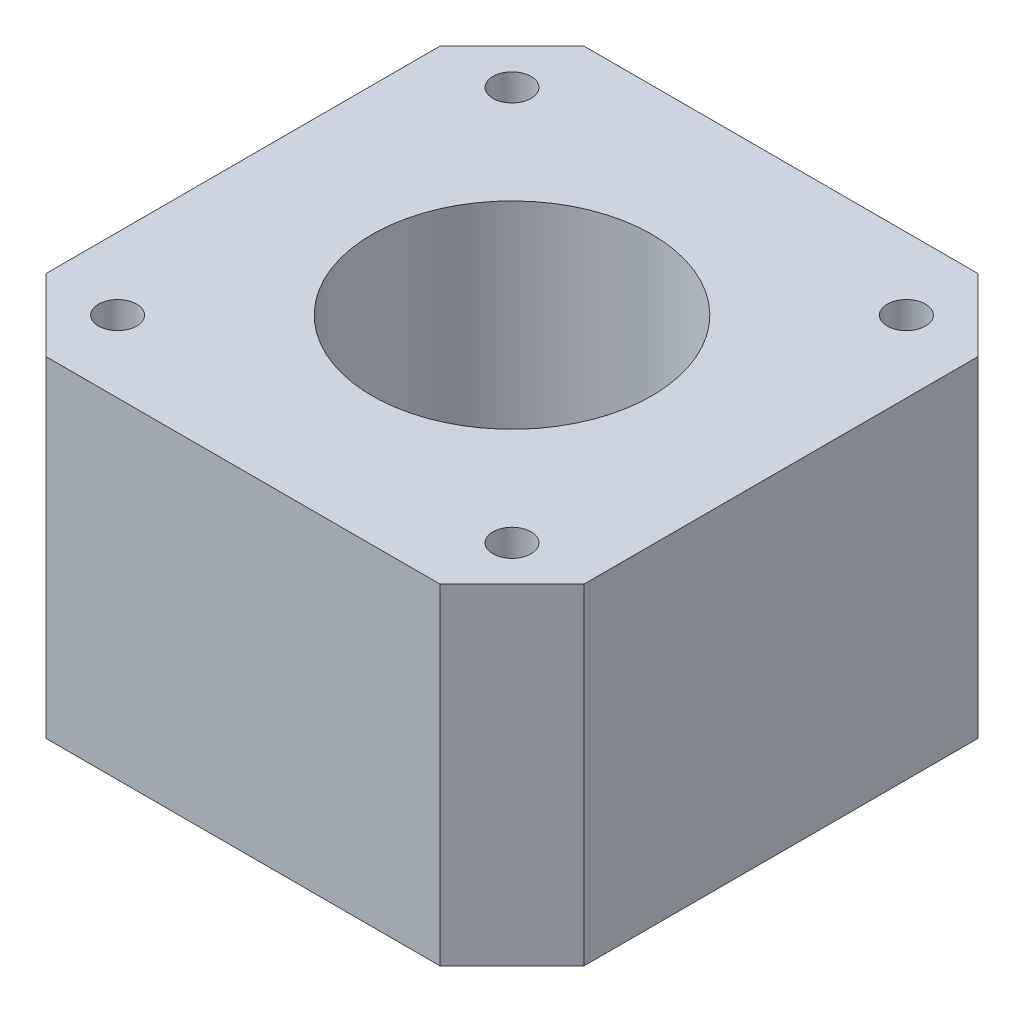
ISO-10303-21;
HEADER;
FILE_DESCRIPTION(('STEP AP214'),'2;1');
FILE_NAME('part.step','',(''),(''),'','','');
FILE_SCHEMA(('AUTOMOTIVE_DESIGN { 1 0 10303 214 1 1 1 1 }'));
ENDSEC;
DATA;
#1=APPLICATION_CONTEXT('core data for automotive mechanical design processes');
#2=APPLICATION_PROTOCOL_DEFINITION('international standard','automotive_design',2000,#1);
#3=PRODUCT_CONTEXT('',#1,'mechanical');
#4=PRODUCT('Part','Part','',(#3));
#5=PRODUCT_RELATED_PRODUCT_CATEGORY('part','',(#4));
#6=PRODUCT_DEFINITION_FORMATION('','',#4);
#7=PRODUCT_DEFINITION_CONTEXT('part definition',#1,'design');
#8=PRODUCT_DEFINITION('design','',#6,#7);
#9=PRODUCT_DEFINITION_SHAPE('','',#8);
#10=(LENGTH_UNIT() NAMED_UNIT(*) SI_UNIT(.MILLI.,.METRE.));
#11=(NAMED_UNIT(*) PLANE_ANGLE_UNIT() SI_UNIT($,.RADIAN.));
#12=(NAMED_UNIT(*) SI_UNIT($,.STERADIAN.) SOLID_ANGLE_UNIT());
#13=UNCERTAINTY_MEASURE_WITH_UNIT(LENGTH_MEASURE(1.E-05),#10,'distance_accuracy_value','');
#14=(GEOMETRIC_REPRESENTATION_CONTEXT(3) GLOBAL_UNCERTAINTY_ASSIGNED_CONTEXT((#13)) GLOBAL_UNIT_ASSIGNED_CONTEXT((#10,
#11,#12)) REPRESENTATION_CONTEXT('',''));
#15=CARTESIAN_POINT('',(0.,0.,0.));
#16=DIRECTION('',(0.,0.,1.));
#17=DIRECTION('',(1.,0.,0.));
#18=AXIS2_PLACEMENT_3D('',#15,#16,#17);
#19=CARTESIAN_POINT('',(0.,26.,21.15));
#20=DIRECTION('',(0.,0.,-1.));
#21=DIRECTION('',(-1.,0.,0.));
#22=AXIS2_PLACEMENT_3D('',#19,#20,#21);
#23=PLANE('',#22);
#24=DIRECTION('',(1.,0.,0.));
#25=VECTOR('',#24,1.);
#26=CARTESIAN_POINT('',(0.,0.,21.15));
#27=LINE('',#26,#25);
#28=CARTESIAN_POINT('',(-15.4931457505076,0.,21.15));
#29=VERTEX_POINT('',#28);
#30=CARTESIAN_POINT('',(15.4931457505076,0.,21.15));
#31=VERTEX_POINT('',#30);
#32=EDGE_CURVE('E159',#29,#31,#27,.T.);
#33=ORIENTED_EDGE('',*,*,#32,.T.);
#34=DIRECTION('',(0.,-1.,0.));
#35=VECTOR('',#34,1.);
#36=CARTESIAN_POINT('',(15.4931457505076,26.,21.15));
#37=LINE('',#36,#35);
#38=CARTESIAN_POINT('',(15.4931457505076,26.,21.15));
#39=VERTEX_POINT('',#38);
#40=EDGE_CURVE('E201',#39,#31,#37,.T.);
#41=ORIENTED_EDGE('',*,*,#40,.F.);
#42=DIRECTION('',(1.,0.,0.));
#43=VECTOR('',#42,1.);
#44=CARTESIAN_POINT('',(0.,26.,21.15));
#45=LINE('',#44,#43);
#46=CARTESIAN_POINT('',(-15.4931457505076,26.,21.15));
#47=VERTEX_POINT('',#46);
#48=EDGE_CURVE('E234',#47,#39,#45,.T.);
#49=ORIENTED_EDGE('',*,*,#48,.F.);
#50=DIRECTION('',(0.,-1.,0.));
#51=VECTOR('',#50,1.);
#52=CARTESIAN_POINT('',(-15.4931457505076,26.,21.15));
#53=LINE('',#52,#51);
#54=EDGE_CURVE('E154',#47,#29,#53,.T.);
#55=ORIENTED_EDGE('',*,*,#54,.T.);
#56=EDGE_LOOP('',(#33,#41,#49,#55));
#57=FACE_BOUND('',#56,.T.);
#58=ADVANCED_FACE('F49',(#57),#23,.F.);
#59=CARTESIAN_POINT('',(18.3215728752538,26.,18.3215728752538));
#60=DIRECTION('',(-0.707106781186548,0.,-0.707106781186547));
#61=DIRECTION('',(-0.707106781186547,0.,0.707106781186548));
#62=AXIS2_PLACEMENT_3D('',#59,#60,#61);
#63=PLANE('',#62);
#64=DIRECTION('',(0.707106781186547,0.,-0.707106781186548));
#65=VECTOR('',#64,1.);
#66=CARTESIAN_POINT('',(18.3215728752538,0.,18.3215728752538));
#67=LINE('',#66,#65);
#68=CARTESIAN_POINT('',(21.15,0.,15.4931457505076));
#69=VERTEX_POINT('',#68);
#70=EDGE_CURVE('E163',#31,#69,#67,.T.);
#71=ORIENTED_EDGE('',*,*,#70,.T.);
#72=DIRECTION('',(0.,-1.,0.));
#73=VECTOR('',#72,1.);
#74=CARTESIAN_POINT('',(21.15,26.,15.4931457505076));
#75=LINE('',#74,#73);
#76=CARTESIAN_POINT('',(21.15,26.,15.4931457505076));
#77=VERTEX_POINT('',#76);
#78=EDGE_CURVE('E198',#77,#69,#75,.T.);
#79=ORIENTED_EDGE('',*,*,#78,.F.);
#80=DIRECTION('',(0.707106781186547,0.,-0.707106781186548));
#81=VECTOR('',#80,1.);
#82=CARTESIAN_POINT('',(18.3215728752538,26.,18.3215728752538));
#83=LINE('',#82,#81);
#84=EDGE_CURVE('E110',#39,#77,#83,.T.);
#85=ORIENTED_EDGE('',*,*,#84,.F.);
#86=ORIENTED_EDGE('',*,*,#40,.T.);
#87=EDGE_LOOP('',(#71,#79,#85,#86));
#88=FACE_BOUND('',#87,.T.);
#89=ADVANCED_FACE('F278',(#88),#63,.F.);
#90=CARTESIAN_POINT('',(21.15,26.,0.));
#91=DIRECTION('',(1.,0.,0.));
#92=DIRECTION('',(0.,0.,-1.));
#93=AXIS2_PLACEMENT_3D('',#90,#91,#92);
#94=PLANE('',#93);
#95=DIRECTION('',(0.,0.,1.));
#96=VECTOR('',#95,1.);
#97=CARTESIAN_POINT('',(21.15,0.,0.));
#98=LINE('',#97,#96);
#99=CARTESIAN_POINT('',(21.15,0.,-15.4931457505076));
#100=VERTEX_POINT('',#99);
#101=EDGE_CURVE('E167',#100,#69,#98,.T.);
#102=ORIENTED_EDGE('',*,*,#101,.F.);
#103=DIRECTION('',(0.,-1.,0.));
#104=VECTOR('',#103,1.);
#105=CARTESIAN_POINT('',(21.15,26.,-15.4931457505076));
#106=LINE('',#105,#104);
#107=CARTESIAN_POINT('',(21.15,26.,-15.4931457505076));
#108=VERTEX_POINT('',#107);
#109=EDGE_CURVE('E195',#108,#100,#106,.T.);
#110=ORIENTED_EDGE('',*,*,#109,.F.);
#111=DIRECTION('',(0.,0.,1.));
#112=VECTOR('',#111,1.);
#113=CARTESIAN_POINT('',(21.15,26.,0.));
#114=LINE('',#113,#112);
#115=EDGE_CURVE('E245',#108,#77,#114,.T.);
#116=ORIENTED_EDGE('',*,*,#115,.T.);
#117=ORIENTED_EDGE('',*,*,#78,.T.);
#118=EDGE_LOOP('',(#102,#110,#116,#117));
#119=FACE_BOUND('',#118,.T.);
#120=ADVANCED_FACE('F283',(#119),#94,.T.);
#121=CARTESIAN_POINT('',(18.3215728752538,26.,-18.3215728752538));
#122=DIRECTION('',(0.707106781186548,0.,-0.707106781186546));
#123=DIRECTION('',(-0.707106781186547,0.,-0.707106781186549));
#124=AXIS2_PLACEMENT_3D('',#121,#122,#123);
#125=PLANE('',#124);
#126=DIRECTION('',(0.707106781186546,0.,0.707106781186549));
#127=VECTOR('',#126,1.);
#128=CARTESIAN_POINT('',(18.3215728752538,0.,-18.3215728752538));
#129=LINE('',#128,#127);
#130=CARTESIAN_POINT('',(15.4931457505076,0.,-21.15));
#131=VERTEX_POINT('',#130);
#132=EDGE_CURVE('E171',#131,#100,#129,.T.);
#133=ORIENTED_EDGE('',*,*,#132,.F.);
#134=DIRECTION('',(0.,-1.,0.));
#135=VECTOR('',#134,1.);
#136=CARTESIAN_POINT('',(15.4931457505076,26.,-21.15));
#137=LINE('',#136,#135);
#138=CARTESIAN_POINT('',(15.4931457505076,26.,-21.15));
#139=VERTEX_POINT('',#138);
#140=EDGE_CURVE('E192',#139,#131,#137,.T.);
#141=ORIENTED_EDGE('',*,*,#140,.F.);
#142=DIRECTION('',(0.707106781186546,0.,0.707106781186549));
#143=VECTOR('',#142,1.);
#144=CARTESIAN_POINT('',(18.3215728752538,26.,-18.3215728752538));
#145=LINE('',#144,#143);
#146=EDGE_CURVE('E148',#139,#108,#145,.T.);
#147=ORIENTED_EDGE('',*,*,#146,.T.);
#148=ORIENTED_EDGE('',*,*,#109,.T.);
#149=EDGE_LOOP('',(#133,#141,#147,#148));
#150=FACE_BOUND('',#149,.T.);
#151=ADVANCED_FACE('F252',(#150),#125,.T.);
#152=CARTESIAN_POINT('',(0.,26.,-21.15));
#153=DIRECTION('',(0.,0.,-1.));
#154=DIRECTION('',(-1.,0.,0.));
#155=AXIS2_PLACEMENT_3D('',#152,#153,#154);
#156=PLANE('',#155);
#157=DIRECTION('',(1.,0.,0.));
#158=VECTOR('',#157,1.);
#159=CARTESIAN_POINT('',(0.,0.,-21.15));
#160=LINE('',#159,#158);
#161=CARTESIAN_POINT('',(-15.4931457505076,0.,-21.15));
#162=VERTEX_POINT('',#161);
#163=EDGE_CURVE('E175',#162,#131,#160,.T.);
#164=ORIENTED_EDGE('',*,*,#163,.F.);
#165=DIRECTION('',(0.,-1.,0.));
#166=VECTOR('',#165,1.);
#167=CARTESIAN_POINT('',(-15.4931457505076,26.,-21.15));
#168=LINE('',#167,#166);
#169=CARTESIAN_POINT('',(-15.4931457505076,26.,-21.15));
#170=VERTEX_POINT('',#169);
#171=EDGE_CURVE('E133',#170,#162,#168,.T.);
#172=ORIENTED_EDGE('',*,*,#171,.F.);
#173=DIRECTION('',(1.,0.,0.));
#174=VECTOR('',#173,1.);
#175=CARTESIAN_POINT('',(0.,26.,-21.15));
#176=LINE('',#175,#174);
#177=EDGE_CURVE('E144',#170,#139,#176,.T.);
#178=ORIENTED_EDGE('',*,*,#177,.T.);
#179=ORIENTED_EDGE('',*,*,#140,.T.);
#180=EDGE_LOOP('',(#164,#172,#178,#179));
#181=FACE_BOUND('',#180,.T.);
#182=ADVANCED_FACE('F257',(#181),#156,.T.);
#183=CARTESIAN_POINT('',(-18.3215728752538,26.,-18.3215728752538));
#184=DIRECTION('',(-0.707106781186547,0.,-0.707106781186548));
#185=DIRECTION('',(-0.707106781186548,0.,0.707106781186547));
#186=AXIS2_PLACEMENT_3D('',#183,#184,#185);
#187=PLANE('',#186);
#188=DIRECTION('',(0.707106781186548,0.,-0.707106781186547));
#189=VECTOR('',#188,1.);
#190=CARTESIAN_POINT('',(-18.3215728752538,0.,-18.3215728752538));
#191=LINE('',#190,#189);
#192=CARTESIAN_POINT('',(-21.15,0.,-15.4931457505076));
#193=VERTEX_POINT('',#192);
#194=EDGE_CURVE('E131',#193,#162,#191,.T.);
#195=ORIENTED_EDGE('',*,*,#194,.F.);
#196=DIRECTION('',(0.,-1.,0.));
#197=VECTOR('',#196,1.);
#198=CARTESIAN_POINT('',(-21.15,26.,-15.4931457505076));
#199=LINE('',#198,#197);
#200=CARTESIAN_POINT('',(-21.15,26.,-15.4931457505076));
#201=VERTEX_POINT('',#200);
#202=EDGE_CURVE('E125',#201,#193,#199,.T.);
#203=ORIENTED_EDGE('',*,*,#202,.F.);
#204=DIRECTION('',(0.707106781186548,0.,-0.707106781186547));
#205=VECTOR('',#204,1.);
#206=CARTESIAN_POINT('',(-18.3215728752538,26.,-18.3215728752538));
#207=LINE('',#206,#205);
#208=EDGE_CURVE('E129',#201,#170,#207,.T.);
#209=ORIENTED_EDGE('',*,*,#208,.T.);
#210=ORIENTED_EDGE('',*,*,#171,.T.);
#211=EDGE_LOOP('',(#195,#203,#209,#210));
#212=FACE_BOUND('',#211,.T.);
#213=ADVANCED_FACE('F127',(#212),#187,.T.);
#214=CARTESIAN_POINT('',(-21.15,26.,0.));
#215=DIRECTION('',(1.,0.,0.));
#216=DIRECTION('',(0.,0.,-1.));
#217=AXIS2_PLACEMENT_3D('',#214,#215,#216);
#218=PLANE('',#217);
#219=DIRECTION('',(0.,0.,1.));
#220=VECTOR('',#219,1.);
#221=CARTESIAN_POINT('',(-21.15,0.,0.));
#222=LINE('',#221,#220);
#223=CARTESIAN_POINT('',(-21.15,0.,15.4931457505076));
#224=VERTEX_POINT('',#223);
#225=EDGE_CURVE('E95',#193,#224,#222,.T.);
#226=ORIENTED_EDGE('',*,*,#225,.T.);
#227=DIRECTION('',(0.,-1.,0.));
#228=VECTOR('',#227,1.);
#229=CARTESIAN_POINT('',(-21.15,26.,15.4931457505076));
#230=LINE('',#229,#228);
#231=CARTESIAN_POINT('',(-21.15,26.,15.4931457505076));
#232=VERTEX_POINT('',#231);
#233=EDGE_CURVE('E134',#232,#224,#230,.T.);
#234=ORIENTED_EDGE('',*,*,#233,.F.);
#235=DIRECTION('',(0.,0.,1.));
#236=VECTOR('',#235,1.);
#237=CARTESIAN_POINT('',(-21.15,26.,0.));
#238=LINE('',#237,#236);
#239=EDGE_CURVE('E136',#201,#232,#238,.T.);
#240=ORIENTED_EDGE('',*,*,#239,.F.);
#241=ORIENTED_EDGE('',*,*,#202,.T.);
#242=EDGE_LOOP('',(#226,#234,#240,#241));
#243=FACE_BOUND('',#242,.T.);
#244=ADVANCED_FACE('F137',(#243),#218,.F.);
#245=CARTESIAN_POINT('',(-15.505,26.,-15.505));
#246=DIRECTION('',(0.,-1.,0.));
#247=DIRECTION('',(0.,0.,-1.));
#248=AXIS2_PLACEMENT_3D('',#245,#246,#247);
#249=CYLINDRICAL_SURFACE('',#248,1.5);
#250=CARTESIAN_POINT('',(-15.505,22.5,-15.505));
#251=DIRECTION('',(0.,1.,0.));
#252=DIRECTION('',(0.,0.,1.));
#253=AXIS2_PLACEMENT_3D('',#250,#251,#252);
#254=CIRCLE('',#253,1.5);
#255=CARTESIAN_POINT('',(-15.505,22.5,-17.005));
#256=VERTEX_POINT('',#255);
#257=EDGE_CURVE('E12',#256,#256,#254,.T.);
#258=CARTESIAN_POINT('',(-15.505,26.,-15.505));
#259=DIRECTION('',(0.,1.,0.));
#260=DIRECTION('',(0.,0.,1.));
#261=AXIS2_PLACEMENT_3D('',#258,#259,#260);
#262=CIRCLE('',#261,1.5);
#263=CARTESIAN_POINT('',(-15.505,26.,-17.005));
#264=VERTEX_POINT('',#263);
#265=EDGE_CURVE('E228',#264,#264,#262,.T.);
#266=CARTESIAN_POINT('',(-15.505,22.5,-17.005));
#267=CARTESIAN_POINT('',(-15.505,22.5364583333333,-17.005));
#268=CARTESIAN_POINT('',(-15.505,22.5729166666667,-17.005));
#269=CARTESIAN_POINT('',(-15.505,22.6458333333333,-17.005));
#270=CARTESIAN_POINT('',(-15.505,22.6822916666667,-17.005));
#271=CARTESIAN_POINT('',(-15.505,22.7552083333333,-17.005));
#272=CARTESIAN_POINT('',(-15.505,22.7916666666667,-17.005));
#273=CARTESIAN_POINT('',(-15.505,22.8645833333333,-17.005));
#274=CARTESIAN_POINT('',(-15.505,22.9010416666667,-17.005));
#275=CARTESIAN_POINT('',(-15.505,22.9739583333333,-17.005));
#276=CARTESIAN_POINT('',(-15.505,23.0104166666667,-17.005));
#277=CARTESIAN_POINT('',(-15.505,23.0833333333333,-17.005));
#278=CARTESIAN_POINT('',(-15.505,23.1197916666667,-17.005));
#279=CARTESIAN_POINT('',(-15.505,23.1927083333333,-17.005));
#280=CARTESIAN_POINT('',(-15.505,23.2291666666667,-17.005));
#281=CARTESIAN_POINT('',(-15.505,23.3020833333333,-17.005));
#282=CARTESIAN_POINT('',(-15.505,23.3385416666667,-17.005));
#283=CARTESIAN_POINT('',(-15.505,23.4114583333333,-17.005));
#284=CARTESIAN_POINT('',(-15.505,23.4479166666667,-17.005));
#285=CARTESIAN_POINT('',(-15.505,23.5208333333333,-17.005));
#286=CARTESIAN_POINT('',(-15.505,23.5572916666667,-17.005));
#287=CARTESIAN_POINT('',(-15.505,23.6302083333333,-17.005));
#288=CARTESIAN_POINT('',(-15.505,23.6666666666667,-17.005));
#289=CARTESIAN_POINT('',(-15.505,23.7395833333333,-17.005));
#290=CARTESIAN_POINT('',(-15.505,23.7760416666667,-17.005));
#291=CARTESIAN_POINT('',(-15.505,23.8489583333333,-17.005));
#292=CARTESIAN_POINT('',(-15.505,23.8854166666667,-17.005));
#293=CARTESIAN_POINT('',(-15.505,23.9583333333333,-17.005));
#294=CARTESIAN_POINT('',(-15.505,23.9947916666667,-17.005));
#295=CARTESIAN_POINT('',(-15.505,24.0677083333333,-17.005));
#296=CARTESIAN_POINT('',(-15.505,24.1041666666667,-17.005));
#297=CARTESIAN_POINT('',(-15.505,24.1770833333333,-17.005));
#298=CARTESIAN_POINT('',(-15.505,24.2135416666667,-17.005));
#299=CARTESIAN_POINT('',(-15.505,24.2864583333333,-17.005));
#300=CARTESIAN_POINT('',(-15.505,24.3229166666667,-17.005));
#301=CARTESIAN_POINT('',(-15.505,24.3958333333333,-17.005));
#302=CARTESIAN_POINT('',(-15.505,24.4322916666667,-17.005));
#303=CARTESIAN_POINT('',(-15.505,24.5052083333333,-17.005));
#304=CARTESIAN_POINT('',(-15.505,24.5416666666667,-17.005));
#305=CARTESIAN_POINT('',(-15.505,24.6145833333333,-17.005));
#306=CARTESIAN_POINT('',(-15.505,24.6510416666667,-17.005));
#307=CARTESIAN_POINT('',(-15.505,24.7239583333333,-17.005));
#308=CARTESIAN_POINT('',(-15.505,24.7604166666667,-17.005));
#309=CARTESIAN_POINT('',(-15.505,24.8333333333333,-17.005));
#310=CARTESIAN_POINT('',(-15.505,24.8697916666667,-17.005));
#311=CARTESIAN_POINT('',(-15.505,24.9427083333333,-17.005));
#312=CARTESIAN_POINT('',(-15.505,24.9791666666667,-17.005));
#313=CARTESIAN_POINT('',(-15.505,25.0520833333333,-17.005));
#314=CARTESIAN_POINT('',(-15.505,25.0885416666667,-17.005));
#315=CARTESIAN_POINT('',(-15.505,25.1614583333333,-17.005));
#316=CARTESIAN_POINT('',(-15.505,25.1979166666667,-17.005));
#317=CARTESIAN_POINT('',(-15.505,25.2708333333333,-17.005));
#318=CARTESIAN_POINT('',(-15.505,25.3072916666667,-17.005));
#319=CARTESIAN_POINT('',(-15.505,25.3802083333333,-17.005));
#320=CARTESIAN_POINT('',(-15.505,25.4166666666667,-17.005));
#321=CARTESIAN_POINT('',(-15.505,25.4895833333333,-17.005));
#322=CARTESIAN_POINT('',(-15.505,25.5260416666667,-17.005));
#323=CARTESIAN_POINT('',(-15.505,25.5989583333333,-17.005));
#324=CARTESIAN_POINT('',(-15.505,25.6354166666667,-17.005));
#325=CARTESIAN_POINT('',(-15.505,25.7083333333333,-17.005));
#326=CARTESIAN_POINT('',(-15.505,25.7447916666667,-17.005));
#327=CARTESIAN_POINT('',(-15.505,25.8177083333333,-17.005));
#328=CARTESIAN_POINT('',(-15.505,25.8541666666667,-17.005));
#329=CARTESIAN_POINT('',(-15.505,25.9270833333333,-17.005));
#330=CARTESIAN_POINT('',(-15.505,25.9635416666667,-17.005));
#331=CARTESIAN_POINT('',(-15.505,26.,-17.005));
#332=B_SPLINE_CURVE_WITH_KNOTS('',3,(#266,#267,#268,#269,#270,#271,#272,#273,#274,#275,#276,
#277,#278,#279,#280,#281,#282,#283,#284,#285,#286,#287,#288,#289,#290,#291,#292,#293,#294,#295,
#296,#297,#298,#299,#300,#301,#302,#303,#304,#305,#306,#307,#308,#309,#310,#311,#312,#313,#314,
#315,#316,#317,#318,#319,#320,#321,#322,#323,#324,#325,#326,#327,#328,#329,#330,#331),
.UNSPECIFIED.,.F.,.F.,(4,2,2,2,2,2,2,2,2,2,2,2,2,2,2,2,2,2,2,2,2,2,2,2,2,2,2,2,2,2,2,2,4),(0.,
0.109375000000002,0.21875,0.328125000000002,0.4375,0.546875000000002,0.656250000000001,
0.765625000000002,0.875000000000001,0.984375000000003,1.09375,1.203125,1.3125,1.421875,1.53125,
1.640625,1.75,1.859375,1.96875,2.078125,2.1875,2.296875,2.40625,2.515625,2.625,2.734375,2.84375,
2.953125,3.0625,3.171875,3.28125,3.390625,3.5),.UNSPECIFIED.);
#333=EDGE_CURVE('BSEAM221',#256,#264,#332,.T.);
#334=ORIENTED_EDGE('',*,*,#257,.F.);
#335=ORIENTED_EDGE('',*,*,#265,.T.);
#336=ORIENTED_EDGE('',*,*,#333,.T.);
#337=ORIENTED_EDGE('',*,*,#333,.F.);
#338=EDGE_LOOP('',(#334,#336,#335,#337));
#339=FACE_BOUND('',#338,.T.);
#340=ADVANCED_FACE('F221',(#339),#249,.F.);
#341=CARTESIAN_POINT('',(15.505,26.,-15.505));
#342=DIRECTION('',(0.,-1.,0.));
#343=DIRECTION('',(0.,0.,-1.));
#344=AXIS2_PLACEMENT_3D('',#341,#342,#343);
#345=CYLINDRICAL_SURFACE('',#344,1.5);
#346=CARTESIAN_POINT('',(15.505,22.5,-15.505));
#347=DIRECTION('',(0.,1.,0.));
#348=DIRECTION('',(0.,0.,1.));
#349=AXIS2_PLACEMENT_3D('',#346,#347,#348);
#350=CIRCLE('',#349,1.5);
#351=CARTESIAN_POINT('',(15.505,22.5,-17.005));
#352=VERTEX_POINT('',#351);
#353=EDGE_CURVE('E59',#352,#352,#350,.T.);
#354=CARTESIAN_POINT('',(15.505,26.,-15.505));
#355=DIRECTION('',(0.,1.,0.));
#356=DIRECTION('',(0.,0.,1.));
#357=AXIS2_PLACEMENT_3D('',#354,#355,#356);
#358=CIRCLE('',#357,1.5);
#359=CARTESIAN_POINT('',(15.505,26.,-17.005));
#360=VERTEX_POINT('',#359);
#361=EDGE_CURVE('E225',#360,#360,#358,.T.);
#362=CARTESIAN_POINT('',(15.505,22.5,-17.005));
#363=CARTESIAN_POINT('',(15.505,22.5364583333333,-17.005));
#364=CARTESIAN_POINT('',(15.505,22.5729166666667,-17.005));
#365=CARTESIAN_POINT('',(15.505,22.6458333333333,-17.005));
#366=CARTESIAN_POINT('',(15.505,22.6822916666667,-17.005));
#367=CARTESIAN_POINT('',(15.505,22.7552083333333,-17.005));
#368=CARTESIAN_POINT('',(15.505,22.7916666666667,-17.005));
#369=CARTESIAN_POINT('',(15.505,22.8645833333333,-17.005));
#370=CARTESIAN_POINT('',(15.505,22.9010416666667,-17.005));
#371=CARTESIAN_POINT('',(15.505,22.9739583333333,-17.005));
#372=CARTESIAN_POINT('',(15.505,23.0104166666667,-17.005));
#373=CARTESIAN_POINT('',(15.505,23.0833333333333,-17.005));
#374=CARTESIAN_POINT('',(15.505,23.1197916666667,-17.005));
#375=CARTESIAN_POINT('',(15.505,23.1927083333333,-17.005));
#376=CARTESIAN_POINT('',(15.505,23.2291666666667,-17.005));
#377=CARTESIAN_POINT('',(15.505,23.3020833333333,-17.005));
#378=CARTESIAN_POINT('',(15.505,23.3385416666667,-17.005));
#379=CARTESIAN_POINT('',(15.505,23.4114583333333,-17.005));
#380=CARTESIAN_POINT('',(15.505,23.4479166666667,-17.005));
#381=CARTESIAN_POINT('',(15.505,23.5208333333333,-17.005));
#382=CARTESIAN_POINT('',(15.505,23.5572916666667,-17.005));
#383=CARTESIAN_POINT('',(15.505,23.6302083333333,-17.005));
#384=CARTESIAN_POINT('',(15.505,23.6666666666667,-17.005));
#385=CARTESIAN_POINT('',(15.505,23.7395833333333,-17.005));
#386=CARTESIAN_POINT('',(15.505,23.7760416666667,-17.005));
#387=CARTESIAN_POINT('',(15.505,23.8489583333333,-17.005));
#388=CARTESIAN_POINT('',(15.505,23.8854166666667,-17.005));
#389=CARTESIAN_POINT('',(15.505,23.9583333333333,-17.005));
#390=CARTESIAN_POINT('',(15.505,23.9947916666667,-17.005));
#391=CARTESIAN_POINT('',(15.505,24.0677083333333,-17.005));
#392=CARTESIAN_POINT('',(15.505,24.1041666666667,-17.005));
#393=CARTESIAN_POINT('',(15.505,24.1770833333333,-17.005));
#394=CARTESIAN_POINT('',(15.505,24.2135416666667,-17.005));
#395=CARTESIAN_POINT('',(15.505,24.2864583333333,-17.005));
#396=CARTESIAN_POINT('',(15.505,24.3229166666667,-17.005));
#397=CARTESIAN_POINT('',(15.505,24.3958333333333,-17.005));
#398=CARTESIAN_POINT('',(15.505,24.4322916666667,-17.005));
#399=CARTESIAN_POINT('',(15.505,24.5052083333333,-17.005));
#400=CARTESIAN_POINT('',(15.505,24.5416666666667,-17.005));
#401=CARTESIAN_POINT('',(15.505,24.6145833333333,-17.005));
#402=CARTESIAN_POINT('',(15.505,24.6510416666667,-17.005));
#403=CARTESIAN_POINT('',(15.505,24.7239583333333,-17.005));
#404=CARTESIAN_POINT('',(15.505,24.7604166666667,-17.005));
#405=CARTESIAN_POINT('',(15.505,24.8333333333333,-17.005));
#406=CARTESIAN_POINT('',(15.505,24.8697916666667,-17.005));
#407=CARTESIAN_POINT('',(15.505,24.9427083333333,-17.005));
#408=CARTESIAN_POINT('',(15.505,24.9791666666667,-17.005));
#409=CARTESIAN_POINT('',(15.505,25.0520833333333,-17.005));
#410=CARTESIAN_POINT('',(15.505,25.0885416666667,-17.005));
#411=CARTESIAN_POINT('',(15.505,25.1614583333333,-17.005));
#412=CARTESIAN_POINT('',(15.505,25.1979166666667,-17.005));
#413=CARTESIAN_POINT('',(15.505,25.2708333333333,-17.005));
#414=CARTESIAN_POINT('',(15.505,25.3072916666667,-17.005));
#415=CARTESIAN_POINT('',(15.505,25.3802083333333,-17.005));
#416=CARTESIAN_POINT('',(15.505,25.4166666666667,-17.005));
#417=CARTESIAN_POINT('',(15.505,25.4895833333333,-17.005));
#418=CARTESIAN_POINT('',(15.505,25.5260416666667,-17.005));
#419=CARTESIAN_POINT('',(15.505,25.5989583333333,-17.005));
#420=CARTESIAN_POINT('',(15.505,25.6354166666667,-17.005));
#421=CARTESIAN_POINT('',(15.505,25.7083333333333,-17.005));
#422=CARTESIAN_POINT('',(15.505,25.7447916666667,-17.005));
#423=CARTESIAN_POINT('',(15.505,25.8177083333333,-17.005));
#424=CARTESIAN_POINT('',(15.505,25.8541666666667,-17.005));
#425=CARTESIAN_POINT('',(15.505,25.9270833333333,-17.005));
#426=CARTESIAN_POINT('',(15.505,25.9635416666667,-17.005));
#427=CARTESIAN_POINT('',(15.505,26.,-17.005));
#428=B_SPLINE_CURVE_WITH_KNOTS('',3,(#362,#363,#364,#365,#366,#367,#368,#369,#370,#371,#372,
#373,#374,#375,#376,#377,#378,#379,#380,#381,#382,#383,#384,#385,#386,#387,#388,#389,#390,#391,
#392,#393,#394,#395,#396,#397,#398,#399,#400,#401,#402,#403,#404,#405,#406,#407,#408,#409,#410,
#411,#412,#413,#414,#415,#416,#417,#418,#419,#420,#421,#422,#423,#424,#425,#426,#427),
.UNSPECIFIED.,.F.,.F.,(4,2,2,2,2,2,2,2,2,2,2,2,2,2,2,2,2,2,2,2,2,2,2,2,2,2,2,2,2,2,2,2,4),(0.,
0.109375000000002,0.21875,0.328125000000002,0.4375,0.546875000000002,0.656250000000001,
0.765625000000002,0.875000000000001,0.984375000000003,1.09375,1.203125,1.3125,1.421875,1.53125,
1.640625,1.75,1.859375,1.96875,2.078125,2.1875,2.296875,2.40625,2.515625,2.625,2.734375,2.84375,
2.953125,3.0625,3.171875,3.28125,3.390625,3.5),.UNSPECIFIED.);
#429=EDGE_CURVE('BSEAM217',#352,#360,#428,.T.);
#430=ORIENTED_EDGE('',*,*,#353,.F.);
#431=ORIENTED_EDGE('',*,*,#361,.T.);
#432=ORIENTED_EDGE('',*,*,#429,.T.);
#433=ORIENTED_EDGE('',*,*,#429,.F.);
#434=EDGE_LOOP('',(#430,#432,#431,#433));
#435=FACE_BOUND('',#434,.T.);
#436=ADVANCED_FACE('F217',(#435),#345,.F.);
#437=CARTESIAN_POINT('',(15.505,26.,15.505));
#438=DIRECTION('',(0.,-1.,0.));
#439=DIRECTION('',(0.,0.,-1.));
#440=AXIS2_PLACEMENT_3D('',#437,#438,#439);
#441=CYLINDRICAL_SURFACE('',#440,1.5);
#442=CARTESIAN_POINT('',(15.505,22.5,15.505));
#443=DIRECTION('',(0.,1.,0.));
#444=DIRECTION('',(0.,0.,1.));
#445=AXIS2_PLACEMENT_3D('',#442,#443,#444);
#446=CIRCLE('',#445,1.5);
#447=CARTESIAN_POINT('',(15.505,22.5,14.005));
#448=VERTEX_POINT('',#447);
#449=EDGE_CURVE('E204',#448,#448,#446,.T.);
#450=CARTESIAN_POINT('',(15.505,26.,15.505));
#451=DIRECTION('',(0.,1.,0.));
#452=DIRECTION('',(0.,0.,1.));
#453=AXIS2_PLACEMENT_3D('',#450,#451,#452);
#454=CIRCLE('',#453,1.5);
#455=CARTESIAN_POINT('',(15.505,26.,14.005));
#456=VERTEX_POINT('',#455);
#457=EDGE_CURVE('E229',#456,#456,#454,.T.);
#458=CARTESIAN_POINT('',(15.505,22.5,14.005));
#459=CARTESIAN_POINT('',(15.505,22.5364583333333,14.005));
#460=CARTESIAN_POINT('',(15.505,22.5729166666667,14.005));
#461=CARTESIAN_POINT('',(15.505,22.6458333333333,14.005));
#462=CARTESIAN_POINT('',(15.505,22.6822916666667,14.005));
#463=CARTESIAN_POINT('',(15.505,22.7552083333333,14.005));
#464=CARTESIAN_POINT('',(15.505,22.7916666666667,14.005));
#465=CARTESIAN_POINT('',(15.505,22.8645833333333,14.005));
#466=CARTESIAN_POINT('',(15.505,22.9010416666667,14.005));
#467=CARTESIAN_POINT('',(15.505,22.9739583333333,14.005));
#468=CARTESIAN_POINT('',(15.505,23.0104166666667,14.005));
#469=CARTESIAN_POINT('',(15.505,23.0833333333333,14.005));
#470=CARTESIAN_POINT('',(15.505,23.1197916666667,14.005));
#471=CARTESIAN_POINT('',(15.505,23.1927083333333,14.005));
#472=CARTESIAN_POINT('',(15.505,23.2291666666667,14.005));
#473=CARTESIAN_POINT('',(15.505,23.3020833333333,14.005));
#474=CARTESIAN_POINT('',(15.505,23.3385416666667,14.005));
#475=CARTESIAN_POINT('',(15.505,23.4114583333333,14.005));
#476=CARTESIAN_POINT('',(15.505,23.4479166666667,14.005));
#477=CARTESIAN_POINT('',(15.505,23.5208333333333,14.005));
#478=CARTESIAN_POINT('',(15.505,23.5572916666667,14.005));
#479=CARTESIAN_POINT('',(15.505,23.6302083333333,14.005));
#480=CARTESIAN_POINT('',(15.505,23.6666666666667,14.005));
#481=CARTESIAN_POINT('',(15.505,23.7395833333333,14.005));
#482=CARTESIAN_POINT('',(15.505,23.7760416666667,14.005));
#483=CARTESIAN_POINT('',(15.505,23.8489583333333,14.005));
#484=CARTESIAN_POINT('',(15.505,23.8854166666667,14.005));
#485=CARTESIAN_POINT('',(15.505,23.9583333333333,14.005));
#486=CARTESIAN_POINT('',(15.505,23.9947916666667,14.005));
#487=CARTESIAN_POINT('',(15.505,24.0677083333333,14.005));
#488=CARTESIAN_POINT('',(15.505,24.1041666666667,14.005));
#489=CARTESIAN_POINT('',(15.505,24.1770833333333,14.005));
#490=CARTESIAN_POINT('',(15.505,24.2135416666667,14.005));
#491=CARTESIAN_POINT('',(15.505,24.2864583333333,14.005));
#492=CARTESIAN_POINT('',(15.505,24.3229166666667,14.005));
#493=CARTESIAN_POINT('',(15.505,24.3958333333333,14.005));
#494=CARTESIAN_POINT('',(15.505,24.4322916666667,14.005));
#495=CARTESIAN_POINT('',(15.505,24.5052083333333,14.005));
#496=CARTESIAN_POINT('',(15.505,24.5416666666667,14.005));
#497=CARTESIAN_POINT('',(15.505,24.6145833333333,14.005));
#498=CARTESIAN_POINT('',(15.505,24.6510416666667,14.005));
#499=CARTESIAN_POINT('',(15.505,24.7239583333333,14.005));
#500=CARTESIAN_POINT('',(15.505,24.7604166666667,14.005));
#501=CARTESIAN_POINT('',(15.505,24.8333333333333,14.005));
#502=CARTESIAN_POINT('',(15.505,24.8697916666667,14.005));
#503=CARTESIAN_POINT('',(15.505,24.9427083333333,14.005));
#504=CARTESIAN_POINT('',(15.505,24.9791666666667,14.005));
#505=CARTESIAN_POINT('',(15.505,25.0520833333333,14.005));
#506=CARTESIAN_POINT('',(15.505,25.0885416666667,14.005));
#507=CARTESIAN_POINT('',(15.505,25.1614583333333,14.005));
#508=CARTESIAN_POINT('',(15.505,25.1979166666667,14.005));
#509=CARTESIAN_POINT('',(15.505,25.2708333333333,14.005));
#510=CARTESIAN_POINT('',(15.505,25.3072916666667,14.005));
#511=CARTESIAN_POINT('',(15.505,25.3802083333333,14.005));
#512=CARTESIAN_POINT('',(15.505,25.4166666666667,14.005));
#513=CARTESIAN_POINT('',(15.505,25.4895833333333,14.005));
#514=CARTESIAN_POINT('',(15.505,25.5260416666667,14.005));
#515=CARTESIAN_POINT('',(15.505,25.5989583333333,14.005));
#516=CARTESIAN_POINT('',(15.505,25.6354166666667,14.005));
#517=CARTESIAN_POINT('',(15.505,25.7083333333333,14.005));
#518=CARTESIAN_POINT('',(15.505,25.7447916666667,14.005));
#519=CARTESIAN_POINT('',(15.505,25.8177083333333,14.005));
#520=CARTESIAN_POINT('',(15.505,25.8541666666667,14.005));
#521=CARTESIAN_POINT('',(15.505,25.9270833333333,14.005));
#522=CARTESIAN_POINT('',(15.505,25.9635416666667,14.005));
#523=CARTESIAN_POINT('',(15.505,26.,14.005));
#524=B_SPLINE_CURVE_WITH_KNOTS('',3,(#458,#459,#460,#461,#462,#463,#464,#465,#466,#467,#468,
#469,#470,#471,#472,#473,#474,#475,#476,#477,#478,#479,#480,#481,#482,#483,#484,#485,#486,#487,
#488,#489,#490,#491,#492,#493,#494,#495,#496,#497,#498,#499,#500,#501,#502,#503,#504,#505,#506,
#507,#508,#509,#510,#511,#512,#513,#514,#515,#516,#517,#518,#519,#520,#521,#522,#523),
.UNSPECIFIED.,.F.,.F.,(4,2,2,2,2,2,2,2,2,2,2,2,2,2,2,2,2,2,2,2,2,2,2,2,2,2,2,2,2,2,2,2,4),(0.,
0.109375000000002,0.21875,0.328125000000002,0.4375,0.546875000000002,0.656250000000001,
0.765625000000002,0.875000000000001,0.984375000000003,1.09375,1.203125,1.3125,1.421875,1.53125,
1.640625,1.75,1.859375,1.96875,2.078125,2.1875,2.296875,2.40625,2.515625,2.625,2.734375,2.84375,
2.953125,3.0625,3.171875,3.28125,3.390625,3.5),.UNSPECIFIED.);
#525=EDGE_CURVE('BSEAM220',#448,#456,#524,.T.);
#526=ORIENTED_EDGE('',*,*,#449,.F.);
#527=ORIENTED_EDGE('',*,*,#457,.T.);
#528=ORIENTED_EDGE('',*,*,#525,.T.);
#529=ORIENTED_EDGE('',*,*,#525,.F.);
#530=EDGE_LOOP('',(#526,#528,#527,#529));
#531=FACE_BOUND('',#530,.T.);
#532=ADVANCED_FACE('F220',(#531),#441,.F.);
#533=CARTESIAN_POINT('',(-15.505,26.,15.505));
#534=DIRECTION('',(0.,-1.,0.));
#535=DIRECTION('',(0.,0.,-1.));
#536=AXIS2_PLACEMENT_3D('',#533,#534,#535);
#537=CYLINDRICAL_SURFACE('',#536,1.5);
#538=CARTESIAN_POINT('',(-15.505,22.5,15.505));
#539=DIRECTION('',(0.,1.,0.));
#540=DIRECTION('',(0.,0.,1.));
#541=AXIS2_PLACEMENT_3D('',#538,#539,#540);
#542=CIRCLE('',#541,1.5);
#543=CARTESIAN_POINT('',(-15.505,22.5,14.005));
#544=VERTEX_POINT('',#543);
#545=EDGE_CURVE('E208',#544,#544,#542,.T.);
#546=CARTESIAN_POINT('',(-15.505,26.,15.505));
#547=DIRECTION('',(0.,1.,0.));
#548=DIRECTION('',(0.,0.,1.));
#549=AXIS2_PLACEMENT_3D('',#546,#547,#548);
#550=CIRCLE('',#549,1.5);
#551=CARTESIAN_POINT('',(-15.505,26.,14.005));
#552=VERTEX_POINT('',#551);
#553=EDGE_CURVE('E237',#552,#552,#550,.T.);
#554=CARTESIAN_POINT('',(-15.505,22.5,14.005));
#555=CARTESIAN_POINT('',(-15.505,22.5364583333333,14.005));
#556=CARTESIAN_POINT('',(-15.505,22.5729166666667,14.005));
#557=CARTESIAN_POINT('',(-15.505,22.6458333333333,14.005));
#558=CARTESIAN_POINT('',(-15.505,22.6822916666667,14.005));
#559=CARTESIAN_POINT('',(-15.505,22.7552083333333,14.005));
#560=CARTESIAN_POINT('',(-15.505,22.7916666666667,14.005));
#561=CARTESIAN_POINT('',(-15.505,22.8645833333333,14.005));
#562=CARTESIAN_POINT('',(-15.505,22.9010416666667,14.005));
#563=CARTESIAN_POINT('',(-15.505,22.9739583333333,14.005));
#564=CARTESIAN_POINT('',(-15.505,23.0104166666667,14.005));
#565=CARTESIAN_POINT('',(-15.505,23.0833333333333,14.005));
#566=CARTESIAN_POINT('',(-15.505,23.1197916666667,14.005));
#567=CARTESIAN_POINT('',(-15.505,23.1927083333333,14.005));
#568=CARTESIAN_POINT('',(-15.505,23.2291666666667,14.005));
#569=CARTESIAN_POINT('',(-15.505,23.3020833333333,14.005));
#570=CARTESIAN_POINT('',(-15.505,23.3385416666667,14.005));
#571=CARTESIAN_POINT('',(-15.505,23.4114583333333,14.005));
#572=CARTESIAN_POINT('',(-15.505,23.4479166666667,14.005));
#573=CARTESIAN_POINT('',(-15.505,23.5208333333333,14.005));
#574=CARTESIAN_POINT('',(-15.505,23.5572916666667,14.005));
#575=CARTESIAN_POINT('',(-15.505,23.6302083333333,14.005));
#576=CARTESIAN_POINT('',(-15.505,23.6666666666667,14.005));
#577=CARTESIAN_POINT('',(-15.505,23.7395833333333,14.005));
#578=CARTESIAN_POINT('',(-15.505,23.7760416666667,14.005));
#579=CARTESIAN_POINT('',(-15.505,23.8489583333333,14.005));
#580=CARTESIAN_POINT('',(-15.505,23.8854166666667,14.005));
#581=CARTESIAN_POINT('',(-15.505,23.9583333333333,14.005));
#582=CARTESIAN_POINT('',(-15.505,23.9947916666667,14.005));
#583=CARTESIAN_POINT('',(-15.505,24.0677083333333,14.005));
#584=CARTESIAN_POINT('',(-15.505,24.1041666666667,14.005));
#585=CARTESIAN_POINT('',(-15.505,24.1770833333333,14.005));
#586=CARTESIAN_POINT('',(-15.505,24.2135416666667,14.005));
#587=CARTESIAN_POINT('',(-15.505,24.2864583333333,14.005));
#588=CARTESIAN_POINT('',(-15.505,24.3229166666667,14.005));
#589=CARTESIAN_POINT('',(-15.505,24.3958333333333,14.005));
#590=CARTESIAN_POINT('',(-15.505,24.4322916666667,14.005));
#591=CARTESIAN_POINT('',(-15.505,24.5052083333333,14.005));
#592=CARTESIAN_POINT('',(-15.505,24.5416666666667,14.005));
#593=CARTESIAN_POINT('',(-15.505,24.6145833333333,14.005));
#594=CARTESIAN_POINT('',(-15.505,24.6510416666667,14.005));
#595=CARTESIAN_POINT('',(-15.505,24.7239583333333,14.005));
#596=CARTESIAN_POINT('',(-15.505,24.7604166666667,14.005));
#597=CARTESIAN_POINT('',(-15.505,24.8333333333333,14.005));
#598=CARTESIAN_POINT('',(-15.505,24.8697916666667,14.005));
#599=CARTESIAN_POINT('',(-15.505,24.9427083333333,14.005));
#600=CARTESIAN_POINT('',(-15.505,24.9791666666667,14.005));
#601=CARTESIAN_POINT('',(-15.505,25.0520833333333,14.005));
#602=CARTESIAN_POINT('',(-15.505,25.0885416666667,14.005));
#603=CARTESIAN_POINT('',(-15.505,25.1614583333333,14.005));
#604=CARTESIAN_POINT('',(-15.505,25.1979166666667,14.005));
#605=CARTESIAN_POINT('',(-15.505,25.2708333333333,14.005));
#606=CARTESIAN_POINT('',(-15.505,25.3072916666667,14.005));
#607=CARTESIAN_POINT('',(-15.505,25.3802083333333,14.005));
#608=CARTESIAN_POINT('',(-15.505,25.4166666666667,14.005));
#609=CARTESIAN_POINT('',(-15.505,25.4895833333333,14.005));
#610=CARTESIAN_POINT('',(-15.505,25.5260416666667,14.005));
#611=CARTESIAN_POINT('',(-15.505,25.5989583333333,14.005));
#612=CARTESIAN_POINT('',(-15.505,25.6354166666667,14.005));
#613=CARTESIAN_POINT('',(-15.505,25.7083333333333,14.005));
#614=CARTESIAN_POINT('',(-15.505,25.7447916666667,14.005));
#615=CARTESIAN_POINT('',(-15.505,25.8177083333333,14.005));
#616=CARTESIAN_POINT('',(-15.505,25.8541666666667,14.005));
#617=CARTESIAN_POINT('',(-15.505,25.9270833333333,14.005));
#618=CARTESIAN_POINT('',(-15.505,25.9635416666667,14.005));
#619=CARTESIAN_POINT('',(-15.505,26.,14.005));
#620=B_SPLINE_CURVE_WITH_KNOTS('',3,(#554,#555,#556,#557,#558,#559,#560,#561,#562,#563,#564,
#565,#566,#567,#568,#569,#570,#571,#572,#573,#574,#575,#576,#577,#578,#579,#580,#581,#582,#583,
#584,#585,#586,#587,#588,#589,#590,#591,#592,#593,#594,#595,#596,#597,#598,#599,#600,#601,#602,
#603,#604,#605,#606,#607,#608,#609,#610,#611,#612,#613,#614,#615,#616,#617,#618,#619),
.UNSPECIFIED.,.F.,.F.,(4,2,2,2,2,2,2,2,2,2,2,2,2,2,2,2,2,2,2,2,2,2,2,2,2,2,2,2,2,2,2,2,4),(0.,
0.109375000000002,0.21875,0.328125000000002,0.4375,0.546875000000002,0.656250000000001,
0.765625000000002,0.875000000000001,0.984375000000003,1.09375,1.203125,1.3125,1.421875,1.53125,
1.640625,1.75,1.859375,1.96875,2.078125,2.1875,2.296875,2.40625,2.515625,2.625,2.734375,2.84375,
2.953125,3.0625,3.171875,3.28125,3.390625,3.5),.UNSPECIFIED.);
#621=EDGE_CURVE('BSEAM273',#544,#552,#620,.T.);
#622=ORIENTED_EDGE('',*,*,#545,.F.);
#623=ORIENTED_EDGE('',*,*,#553,.T.);
#624=ORIENTED_EDGE('',*,*,#621,.T.);
#625=ORIENTED_EDGE('',*,*,#621,.F.);
#626=EDGE_LOOP('',(#622,#624,#623,#625));
#627=FACE_BOUND('',#626,.T.);
#628=ADVANCED_FACE('F273',(#627),#537,.F.);
#629=CARTESIAN_POINT('',(0.,26.,0.));
#630=DIRECTION('',(0.,-1.,0.));
#631=DIRECTION('',(0.,0.,-1.));
#632=AXIS2_PLACEMENT_3D('',#629,#630,#631);
#633=CYLINDRICAL_SURFACE('',#632,11.);
#634=CARTESIAN_POINT('',(0.,26.,0.));
#635=DIRECTION('',(0.,1.,0.));
#636=DIRECTION('',(0.,0.,1.));
#637=AXIS2_PLACEMENT_3D('',#634,#635,#636);
#638=CIRCLE('',#637,11.);
#639=CARTESIAN_POINT('',(0.,26.,-11.));
#640=VERTEX_POINT('',#639);
#641=EDGE_CURVE('E185',#640,#640,#638,.T.);
#642=CARTESIAN_POINT('',(0.,0.,0.));
#643=DIRECTION('',(0.,1.,0.));
#644=DIRECTION('',(0.,0.,1.));
#645=AXIS2_PLACEMENT_3D('',#642,#643,#644);
#646=CIRCLE('',#645,11.);
#647=CARTESIAN_POINT('',(0.,0.,-11.));
#648=VERTEX_POINT('',#647);
#649=EDGE_CURVE('E155',#648,#648,#646,.T.);
#650=CARTESIAN_POINT('',(0.,26.,-11.));
#651=CARTESIAN_POINT('',(0.,25.7291666666667,-11.));
#652=CARTESIAN_POINT('',(0.,25.4583333333333,-11.));
#653=CARTESIAN_POINT('',(0.,24.9166666666667,-11.));
#654=CARTESIAN_POINT('',(0.,24.6458333333333,-11.));
#655=CARTESIAN_POINT('',(0.,24.1041666666667,-11.));
#656=CARTESIAN_POINT('',(0.,23.8333333333333,-11.));
#657=CARTESIAN_POINT('',(0.,23.2916666666667,-11.));
#658=CARTESIAN_POINT('',(0.,23.0208333333333,-11.));
#659=CARTESIAN_POINT('',(0.,22.4791666666667,-11.));
#660=CARTESIAN_POINT('',(0.,22.2083333333333,-11.));
#661=CARTESIAN_POINT('',(0.,21.6666666666667,-11.));
#662=CARTESIAN_POINT('',(0.,21.3958333333333,-11.));
#663=CARTESIAN_POINT('',(0.,20.8541666666667,-11.));
#664=CARTESIAN_POINT('',(0.,20.5833333333333,-11.));
#665=CARTESIAN_POINT('',(0.,20.0416666666667,-11.));
#666=CARTESIAN_POINT('',(0.,19.7708333333333,-11.));
#667=CARTESIAN_POINT('',(0.,19.2291666666667,-11.));
#668=CARTESIAN_POINT('',(0.,18.9583333333333,-11.));
#669=CARTESIAN_POINT('',(0.,18.4166666666667,-11.));
#670=CARTESIAN_POINT('',(0.,18.1458333333333,-11.));
#671=CARTESIAN_POINT('',(0.,17.6041666666667,-11.));
#672=CARTESIAN_POINT('',(0.,17.3333333333333,-11.));
#673=CARTESIAN_POINT('',(0.,16.7916666666667,-11.));
#674=CARTESIAN_POINT('',(0.,16.5208333333333,-11.));
#675=CARTESIAN_POINT('',(0.,15.9791666666667,-11.));
#676=CARTESIAN_POINT('',(0.,15.7083333333333,-11.));
#677=CARTESIAN_POINT('',(0.,15.1666666666667,-11.));
#678=CARTESIAN_POINT('',(0.,14.8958333333333,-11.));
#679=CARTESIAN_POINT('',(0.,14.3541666666667,-11.));
#680=CARTESIAN_POINT('',(0.,14.0833333333333,-11.));
#681=CARTESIAN_POINT('',(0.,13.5416666666667,-11.));
#682=CARTESIAN_POINT('',(0.,13.2708333333333,-11.));
#683=CARTESIAN_POINT('',(0.,12.7291666666667,-11.));
#684=CARTESIAN_POINT('',(0.,12.4583333333333,-11.));
#685=CARTESIAN_POINT('',(0.,11.9166666666667,-11.));
#686=CARTESIAN_POINT('',(0.,11.6458333333333,-11.));
#687=CARTESIAN_POINT('',(0.,11.1041666666667,-11.));
#688=CARTESIAN_POINT('',(0.,10.8333333333333,-11.));
#689=CARTESIAN_POINT('',(0.,10.2916666666667,-11.));
#690=CARTESIAN_POINT('',(0.,10.0208333333333,-11.));
#691=CARTESIAN_POINT('',(0.,9.47916666666667,-11.));
#692=CARTESIAN_POINT('',(0.,9.20833333333333,-11.));
#693=CARTESIAN_POINT('',(0.,8.66666666666667,-11.));
#694=CARTESIAN_POINT('',(0.,8.39583333333333,-11.));
#695=CARTESIAN_POINT('',(0.,7.85416666666667,-11.));
#696=CARTESIAN_POINT('',(0.,7.58333333333333,-11.));
#697=CARTESIAN_POINT('',(0.,7.04166666666667,-11.));
#698=CARTESIAN_POINT('',(0.,6.77083333333333,-11.));
#699=CARTESIAN_POINT('',(0.,6.22916666666667,-11.));
#700=CARTESIAN_POINT('',(0.,5.95833333333333,-11.));
#701=CARTESIAN_POINT('',(0.,5.41666666666667,-11.));
#702=CARTESIAN_POINT('',(0.,5.14583333333333,-11.));
#703=CARTESIAN_POINT('',(0.,4.60416666666667,-11.));
#704=CARTESIAN_POINT('',(0.,4.33333333333333,-11.));
#705=CARTESIAN_POINT('',(0.,3.79166666666667,-11.));
#706=CARTESIAN_POINT('',(0.,3.52083333333333,-11.));
#707=CARTESIAN_POINT('',(0.,2.97916666666667,-11.));
#708=CARTESIAN_POINT('',(0.,2.70833333333333,-11.));
#709=CARTESIAN_POINT('',(0.,2.16666666666667,-11.));
#710=CARTESIAN_POINT('',(0.,1.89583333333333,-11.));
#711=CARTESIAN_POINT('',(0.,1.35416666666667,-11.));
#712=CARTESIAN_POINT('',(0.,1.08333333333333,-11.));
#713=CARTESIAN_POINT('',(0.,0.541666666666667,-11.));
#714=CARTESIAN_POINT('',(0.,0.270833333333334,-11.));
#715=CARTESIAN_POINT('',(0.,0.,-11.));
#716=B_SPLINE_CURVE_WITH_KNOTS('',3,(#650,#651,#652,#653,#654,#655,#656,#657,#658,#659,#660,
#661,#662,#663,#664,#665,#666,#667,#668,#669,#670,#671,#672,#673,#674,#675,#676,#677,#678,#679,
#680,#681,#682,#683,#684,#685,#686,#687,#688,#689,#690,#691,#692,#693,#694,#695,#696,#697,#698,
#699,#700,#701,#702,#703,#704,#705,#706,#707,#708,#709,#710,#711,#712,#713,#714,#715),
.UNSPECIFIED.,.F.,.F.,(4,2,2,2,2,2,2,2,2,2,2,2,2,2,2,2,2,2,2,2,2,2,2,2,2,2,2,2,2,2,2,2,4),(0.,
0.812500000000001,1.625,2.4375,3.25,4.0625,4.875,5.6875,6.5,7.3125,8.125,8.9375,9.75,10.5625,
11.375,12.1875,13.,13.8125,14.625,15.4375,16.25,17.0625,17.875,18.6875,19.5,20.3125,21.125,
21.9375,22.75,23.5625,24.375,25.1875,26.),.UNSPECIFIED.);
#717=EDGE_CURVE('BSEAM51',#640,#648,#716,.T.);
#718=ORIENTED_EDGE('',*,*,#641,.T.);
#719=ORIENTED_EDGE('',*,*,#649,.F.);
#720=ORIENTED_EDGE('',*,*,#717,.T.);
#721=ORIENTED_EDGE('',*,*,#717,.F.);
#722=EDGE_LOOP('',(#718,#720,#719,#721));
#723=FACE_BOUND('',#722,.T.);
#724=ADVANCED_FACE('F51',(#723),#633,.F.);
#725=CARTESIAN_POINT('',(-18.3215728752538,26.,18.3215728752538));
#726=DIRECTION('',(0.707106781186548,0.,-0.707106781186547));
#727=DIRECTION('',(-0.707106781186547,0.,-0.707106781186548));
#728=AXIS2_PLACEMENT_3D('',#725,#726,#727);
#729=PLANE('',#728);
#730=DIRECTION('',(0.707106781186547,0.,0.707106781186548));
#731=VECTOR('',#730,1.);
#732=CARTESIAN_POINT('',(-18.3215728752538,0.,18.3215728752538));
#733=LINE('',#732,#731);
#734=EDGE_CURVE('E101',#224,#29,#733,.T.);
#735=ORIENTED_EDGE('',*,*,#734,.T.);
#736=ORIENTED_EDGE('',*,*,#54,.F.);
#737=DIRECTION('',(0.707106781186547,0.,0.707106781186548));
#738=VECTOR('',#737,1.);
#739=CARTESIAN_POINT('',(-18.3215728752538,26.,18.3215728752538));
#740=LINE('',#739,#738);
#741=EDGE_CURVE('E67',#232,#47,#740,.T.);
#742=ORIENTED_EDGE('',*,*,#741,.F.);
#743=ORIENTED_EDGE('',*,*,#233,.T.);
#744=EDGE_LOOP('',(#735,#736,#742,#743));
#745=FACE_BOUND('',#744,.T.);
#746=ADVANCED_FACE('F264',(#745),#729,.F.);
#747=CARTESIAN_POINT('',(0.,26.,0.));
#748=DIRECTION('',(0.,1.,0.));
#749=DIRECTION('',(0.,0.,1.));
#750=AXIS2_PLACEMENT_3D('',#747,#748,#749);
#751=PLANE('',#750);
#752=ORIENTED_EDGE('',*,*,#641,.F.);
#753=EDGE_LOOP('',(#752));
#754=FACE_BOUND('',#753,.T.);
#755=ORIENTED_EDGE('',*,*,#553,.F.);
#756=EDGE_LOOP('',(#755));
#757=FACE_BOUND('',#756,.T.);
#758=ORIENTED_EDGE('',*,*,#457,.F.);
#759=EDGE_LOOP('',(#758));
#760=FACE_BOUND('',#759,.T.);
#761=ORIENTED_EDGE('',*,*,#361,.F.);
#762=EDGE_LOOP('',(#761));
#763=FACE_BOUND('',#762,.T.);
#764=ORIENTED_EDGE('',*,*,#265,.F.);
#765=EDGE_LOOP('',(#764));
#766=FACE_BOUND('',#765,.T.);
#767=ORIENTED_EDGE('',*,*,#48,.T.);
#768=ORIENTED_EDGE('',*,*,#84,.T.);
#769=ORIENTED_EDGE('',*,*,#115,.F.);
#770=ORIENTED_EDGE('',*,*,#146,.F.);
#771=ORIENTED_EDGE('',*,*,#177,.F.);
#772=ORIENTED_EDGE('',*,*,#208,.F.);
#773=ORIENTED_EDGE('',*,*,#239,.T.);
#774=ORIENTED_EDGE('',*,*,#741,.T.);
#775=EDGE_LOOP('',(#767,#768,#769,#770,#771,#772,#773,#774));
#776=FACE_BOUND('',#775,.T.);
#777=ADVANCED_FACE('F141',(#754,#757,#760,#763,#766,#776),#751,.T.);
#778=CARTESIAN_POINT('',(0.,0.,0.));
#779=DIRECTION('',(0.,1.,0.));
#780=DIRECTION('',(0.,0.,1.));
#781=AXIS2_PLACEMENT_3D('',#778,#779,#780);
#782=PLANE('',#781);
#783=ORIENTED_EDGE('',*,*,#649,.T.);
#784=EDGE_LOOP('',(#783));
#785=FACE_BOUND('',#784,.T.);
#786=ORIENTED_EDGE('',*,*,#32,.F.);
#787=ORIENTED_EDGE('',*,*,#734,.F.);
#788=ORIENTED_EDGE('',*,*,#225,.F.);
#789=ORIENTED_EDGE('',*,*,#194,.T.);
#790=ORIENTED_EDGE('',*,*,#163,.T.);
#791=ORIENTED_EDGE('',*,*,#132,.T.);
#792=ORIENTED_EDGE('',*,*,#101,.T.);
#793=ORIENTED_EDGE('',*,*,#70,.F.);
#794=EDGE_LOOP('',(#786,#787,#788,#789,#790,#791,#792,#793));
#795=FACE_BOUND('',#794,.T.);
#796=ADVANCED_FACE('F260',(#785,#795),#782,.F.);
#797=CARTESIAN_POINT('',(0.,22.5,0.));
#798=DIRECTION('',(0.,1.,0.));
#799=DIRECTION('',(0.,0.,1.));
#800=AXIS2_PLACEMENT_3D('',#797,#798,#799);
#801=PLANE('',#800);
#802=ORIENTED_EDGE('',*,*,#449,.T.);
#803=EDGE_LOOP('',(#802));
#804=FACE_BOUND('',#803,.T.);
#805=ADVANCED_FACE('F316',(#804),#801,.T.);
#806=CARTESIAN_POINT('',(0.,22.5,0.));
#807=DIRECTION('',(0.,1.,0.));
#808=DIRECTION('',(0.,0.,1.));
#809=AXIS2_PLACEMENT_3D('',#806,#807,#808);
#810=PLANE('',#809);
#811=ORIENTED_EDGE('',*,*,#545,.T.);
#812=EDGE_LOOP('',(#811));
#813=FACE_BOUND('',#812,.T.);
#814=ADVANCED_FACE('F320',(#813),#810,.T.);
#815=CARTESIAN_POINT('',(0.,22.5,0.));
#816=DIRECTION('',(0.,1.,0.));
#817=DIRECTION('',(0.,0.,1.));
#818=AXIS2_PLACEMENT_3D('',#815,#816,#817);
#819=PLANE('',#818);
#820=ORIENTED_EDGE('',*,*,#353,.T.);
#821=EDGE_LOOP('',(#820));
#822=FACE_BOUND('',#821,.T.);
#823=ADVANCED_FACE('F215',(#822),#819,.T.);
#824=CARTESIAN_POINT('',(0.,22.5,0.));
#825=DIRECTION('',(0.,1.,0.));
#826=DIRECTION('',(0.,0.,1.));
#827=AXIS2_PLACEMENT_3D('',#824,#825,#826);
#828=PLANE('',#827);
#829=ORIENTED_EDGE('',*,*,#257,.T.);
#830=EDGE_LOOP('',(#829));
#831=FACE_BOUND('',#830,.T.);
#832=ADVANCED_FACE('F329',(#831),#828,.T.);
#833=CLOSED_SHELL('',(#58,#89,#120,#151,#182,#213,#244,#340,#436,#532,#628,#724,#746,#777,#796,
#805,#814,#823,#832));
#834=MANIFOLD_SOLID_BREP('B2',#833);
#835=ADVANCED_BREP_SHAPE_REPRESENTATION('',(#18,#834),#14);
#836=SHAPE_DEFINITION_REPRESENTATION(#9,#835);
ENDSEC;
END-ISO-10303-21;
